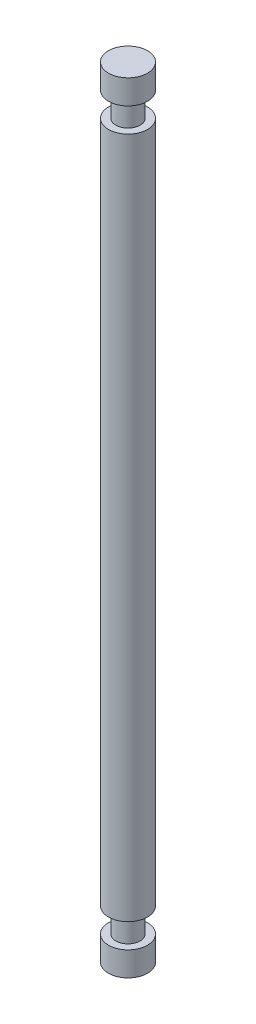
ISO-10303-21;
HEADER;
FILE_DESCRIPTION(('STEP AP214'),'2;1');
FILE_NAME('part.step','',(''),(''),'','','');
FILE_SCHEMA(('AUTOMOTIVE_DESIGN { 1 0 10303 214 1 1 1 1 }'));
ENDSEC;
DATA;
#1=APPLICATION_CONTEXT('core data for automotive mechanical design processes');
#2=APPLICATION_PROTOCOL_DEFINITION('international standard','automotive_design',2000,#1);
#3=PRODUCT_CONTEXT('',#1,'mechanical');
#4=PRODUCT('Part','Part','',(#3));
#5=PRODUCT_RELATED_PRODUCT_CATEGORY('part','',(#4));
#6=PRODUCT_DEFINITION_FORMATION('','',#4);
#7=PRODUCT_DEFINITION_CONTEXT('part definition',#1,'design');
#8=PRODUCT_DEFINITION('design','',#6,#7);
#9=PRODUCT_DEFINITION_SHAPE('','',#8);
#10=(LENGTH_UNIT() NAMED_UNIT(*) SI_UNIT(.MILLI.,.METRE.));
#11=(NAMED_UNIT(*) PLANE_ANGLE_UNIT() SI_UNIT($,.RADIAN.));
#12=(NAMED_UNIT(*) SI_UNIT($,.STERADIAN.) SOLID_ANGLE_UNIT());
#13=UNCERTAINTY_MEASURE_WITH_UNIT(LENGTH_MEASURE(1.E-05),#10,'distance_accuracy_value','');
#14=(GEOMETRIC_REPRESENTATION_CONTEXT(3) GLOBAL_UNCERTAINTY_ASSIGNED_CONTEXT((#13)) GLOBAL_UNIT_ASSIGNED_CONTEXT((#10,
#11,#12)) REPRESENTATION_CONTEXT('',''));
#15=CARTESIAN_POINT('',(0.,0.,0.));
#16=DIRECTION('',(0.,0.,1.));
#17=DIRECTION('',(1.,0.,0.));
#18=AXIS2_PLACEMENT_3D('',#15,#16,#17);
#19=CARTESIAN_POINT('',(0.,30.,0.));
#20=DIRECTION('',(0.,-1.,0.));
#21=DIRECTION('',(0.,0.,-1.));
#22=AXIS2_PLACEMENT_3D('',#19,#20,#21);
#23=CYLINDRICAL_SURFACE('',#22,0.8);
#24=CARTESIAN_POINT('',(0.,0.,0.));
#25=DIRECTION('',(0.,1.,0.));
#26=DIRECTION('',(0.,0.,1.));
#27=AXIS2_PLACEMENT_3D('',#24,#25,#26);
#28=CIRCLE('',#27,0.8);
#29=CARTESIAN_POINT('',(0.,0.,0.8));
#30=VERTEX_POINT('',#29);
#31=EDGE_CURVE('E42',#30,#30,#28,.T.);
#32=ORIENTED_EDGE('',*,*,#31,.T.);
#33=EDGE_LOOP('',(#32));
#34=FACE_BOUND('',#33,.T.);
#35=CARTESIAN_POINT('',(0.,28.,0.));
#36=DIRECTION('',(0.,1.,0.));
#37=DIRECTION('',(0.,0.,1.));
#38=AXIS2_PLACEMENT_3D('',#35,#36,#37);
#39=CIRCLE('',#38,0.8);
#40=CARTESIAN_POINT('',(0.,28.,0.8));
#41=VERTEX_POINT('',#40);
#42=EDGE_CURVE('E51',#41,#41,#39,.T.);
#43=ORIENTED_EDGE('',*,*,#42,.F.);
#44=EDGE_LOOP('',(#43));
#45=FACE_BOUND('',#44,.T.);
#46=ADVANCED_FACE('F31',(#34,#45),#23,.T.);
#47=CARTESIAN_POINT('',(0.,0.,0.));
#48=DIRECTION('',(0.,1.,0.));
#49=DIRECTION('',(0.,0.,1.));
#50=AXIS2_PLACEMENT_3D('',#47,#48,#49);
#51=PLANE('',#50);
#52=CARTESIAN_POINT('',(0.,0.,0.));
#53=DIRECTION('',(0.,1.,0.));
#54=DIRECTION('',(0.,0.,1.));
#55=AXIS2_PLACEMENT_3D('',#52,#53,#54);
#56=CIRCLE('',#55,0.5);
#57=CARTESIAN_POINT('',(0.,0.,0.5));
#58=VERTEX_POINT('',#57);
#59=EDGE_CURVE('E10',#58,#58,#56,.F.);
#60=ORIENTED_EDGE('',*,*,#59,.F.);
#61=EDGE_LOOP('',(#60));
#62=FACE_BOUND('',#61,.T.);
#63=ORIENTED_EDGE('',*,*,#31,.F.);
#64=EDGE_LOOP('',(#63));
#65=FACE_BOUND('',#64,.T.);
#66=ADVANCED_FACE('F87',(#62,#65),#51,.F.);
#67=CARTESIAN_POINT('',(0.,-1.,0.));
#68=DIRECTION('',(0.,1.,0.));
#69=DIRECTION('',(0.,0.,1.));
#70=AXIS2_PLACEMENT_3D('',#67,#68,#69);
#71=CYLINDRICAL_SURFACE('',#70,0.5);
#72=CARTESIAN_POINT('',(0.,-1.,0.));
#73=DIRECTION('',(0.,-1.,0.));
#74=DIRECTION('',(0.,0.,-1.));
#75=AXIS2_PLACEMENT_3D('',#72,#73,#74);
#76=CIRCLE('',#75,0.5);
#77=CARTESIAN_POINT('',(0.,-1.,-0.5));
#78=VERTEX_POINT('',#77);
#79=EDGE_CURVE('E47',#78,#78,#76,.T.);
#80=ORIENTED_EDGE('',*,*,#79,.F.);
#81=EDGE_LOOP('',(#80));
#82=FACE_BOUND('',#81,.T.);
#83=ORIENTED_EDGE('',*,*,#59,.T.);
#84=EDGE_LOOP('',(#83));
#85=FACE_BOUND('',#84,.T.);
#86=ADVANCED_FACE('F92',(#82,#85),#71,.T.);
#87=CARTESIAN_POINT('',(0.,28.,0.));
#88=DIRECTION('',(0.,1.,0.));
#89=DIRECTION('',(0.,0.,1.));
#90=AXIS2_PLACEMENT_3D('',#87,#88,#89);
#91=PLANE('',#90);
#92=CARTESIAN_POINT('',(0.,28.,0.));
#93=DIRECTION('',(0.,1.,0.));
#94=DIRECTION('',(0.,0.,1.));
#95=AXIS2_PLACEMENT_3D('',#92,#93,#94);
#96=CIRCLE('',#95,0.5);
#97=CARTESIAN_POINT('',(0.,28.,0.5));
#98=VERTEX_POINT('',#97);
#99=EDGE_CURVE('E55',#98,#98,#96,.T.);
#100=ORIENTED_EDGE('',*,*,#99,.F.);
#101=EDGE_LOOP('',(#100));
#102=FACE_BOUND('',#101,.T.);
#103=ORIENTED_EDGE('',*,*,#42,.T.);
#104=EDGE_LOOP('',(#103));
#105=FACE_BOUND('',#104,.T.);
#106=ADVANCED_FACE('F108',(#102,#105),#91,.T.);
#107=CARTESIAN_POINT('',(0.,29.,0.));
#108=DIRECTION('',(0.,1.,0.));
#109=DIRECTION('',(0.,0.,1.));
#110=AXIS2_PLACEMENT_3D('',#107,#108,#109);
#111=PLANE('',#110);
#112=CARTESIAN_POINT('',(0.,29.,0.));
#113=DIRECTION('',(0.,1.,0.));
#114=DIRECTION('',(0.,0.,1.));
#115=AXIS2_PLACEMENT_3D('',#112,#113,#114);
#116=CIRCLE('',#115,0.5);
#117=CARTESIAN_POINT('',(0.,29.,0.5));
#118=VERTEX_POINT('',#117);
#119=EDGE_CURVE('E58',#118,#118,#116,.T.);
#120=ORIENTED_EDGE('',*,*,#119,.T.);
#121=EDGE_LOOP('',(#120));
#122=FACE_BOUND('',#121,.T.);
#123=CARTESIAN_POINT('',(0.,29.,0.));
#124=DIRECTION('',(0.,1.,0.));
#125=DIRECTION('',(0.,0.,1.));
#126=AXIS2_PLACEMENT_3D('',#123,#124,#125);
#127=CIRCLE('',#126,0.8);
#128=CARTESIAN_POINT('',(0.,29.,0.8));
#129=VERTEX_POINT('',#128);
#130=EDGE_CURVE('E52',#129,#129,#127,.T.);
#131=ORIENTED_EDGE('',*,*,#130,.F.);
#132=EDGE_LOOP('',(#131));
#133=FACE_BOUND('',#132,.T.);
#134=ADVANCED_FACE('F106',(#122,#133),#111,.F.);
#135=CARTESIAN_POINT('',(0.,28.,0.));
#136=DIRECTION('',(0.,1.,0.));
#137=DIRECTION('',(0.,0.,1.));
#138=AXIS2_PLACEMENT_3D('',#135,#136,#137);
#139=CYLINDRICAL_SURFACE('',#138,0.5);
#140=ORIENTED_EDGE('',*,*,#99,.T.);
#141=EDGE_LOOP('',(#140));
#142=FACE_BOUND('',#141,.T.);
#143=ORIENTED_EDGE('',*,*,#119,.F.);
#144=EDGE_LOOP('',(#143));
#145=FACE_BOUND('',#144,.T.);
#146=ADVANCED_FACE('F101',(#142,#145),#139,.T.);
#147=CARTESIAN_POINT('',(0.,30.,0.));
#148=DIRECTION('',(0.,1.,0.));
#149=DIRECTION('',(0.,0.,1.));
#150=AXIS2_PLACEMENT_3D('',#147,#148,#149);
#151=PLANE('',#150);
#152=CARTESIAN_POINT('',(0.,30.,0.));
#153=DIRECTION('',(0.,1.,0.));
#154=DIRECTION('',(0.,0.,1.));
#155=AXIS2_PLACEMENT_3D('',#152,#153,#154);
#156=CIRCLE('',#155,0.8);
#157=CARTESIAN_POINT('',(0.,30.,0.8));
#158=VERTEX_POINT('',#157);
#159=EDGE_CURVE('E38',#158,#158,#156,.T.);
#160=ORIENTED_EDGE('',*,*,#159,.T.);
#161=EDGE_LOOP('',(#160));
#162=FACE_BOUND('',#161,.T.);
#163=ADVANCED_FACE('F96',(#162),#151,.T.);
#164=ORIENTED_EDGE('',*,*,#130,.T.);
#165=EDGE_LOOP('',(#164));
#166=FACE_BOUND('',#165,.T.);
#167=ORIENTED_EDGE('',*,*,#159,.F.);
#168=EDGE_LOOP('',(#167));
#169=FACE_BOUND('',#168,.T.);
#170=ADVANCED_FACE('F33',(#166,#169),#23,.T.);
#171=CARTESIAN_POINT('',(0.,-2.,0.));
#172=DIRECTION('',(0.,1.,0.));
#173=DIRECTION('',(0.,0.,1.));
#174=AXIS2_PLACEMENT_3D('',#171,#172,#173);
#175=CYLINDRICAL_SURFACE('',#174,0.8);
#176=CARTESIAN_POINT('',(0.,-2.,0.));
#177=DIRECTION('',(0.,-1.,0.));
#178=DIRECTION('',(0.,0.,-1.));
#179=AXIS2_PLACEMENT_3D('',#176,#177,#178);
#180=CIRCLE('',#179,0.8);
#181=CARTESIAN_POINT('',(0.,-2.,-0.8));
#182=VERTEX_POINT('',#181);
#183=EDGE_CURVE('E61',#182,#182,#180,.T.);
#184=ORIENTED_EDGE('',*,*,#183,.F.);
#185=EDGE_LOOP('',(#184));
#186=FACE_BOUND('',#185,.T.);
#187=CARTESIAN_POINT('',(0.,-1.,0.));
#188=DIRECTION('',(0.,-1.,0.));
#189=DIRECTION('',(0.,0.,-1.));
#190=AXIS2_PLACEMENT_3D('',#187,#188,#189);
#191=CIRCLE('',#190,0.8);
#192=CARTESIAN_POINT('',(0.,-1.,-0.8));
#193=VERTEX_POINT('',#192);
#194=EDGE_CURVE('E64',#193,#193,#191,.T.);
#195=ORIENTED_EDGE('',*,*,#194,.T.);
#196=EDGE_LOOP('',(#195));
#197=FACE_BOUND('',#196,.T.);
#198=ADVANCED_FACE('F72',(#186,#197),#175,.T.);
#199=CARTESIAN_POINT('',(0.,-2.,0.));
#200=DIRECTION('',(0.,-1.,0.));
#201=DIRECTION('',(0.,0.,-1.));
#202=AXIS2_PLACEMENT_3D('',#199,#200,#201);
#203=PLANE('',#202);
#204=ORIENTED_EDGE('',*,*,#183,.T.);
#205=EDGE_LOOP('',(#204));
#206=FACE_BOUND('',#205,.T.);
#207=ADVANCED_FACE('F70',(#206),#203,.T.);
#208=CARTESIAN_POINT('',(0.,-1.,0.));
#209=DIRECTION('',(0.,-1.,0.));
#210=DIRECTION('',(0.,0.,-1.));
#211=AXIS2_PLACEMENT_3D('',#208,#209,#210);
#212=PLANE('',#211);
#213=ORIENTED_EDGE('',*,*,#79,.T.);
#214=EDGE_LOOP('',(#213));
#215=FACE_BOUND('',#214,.T.);
#216=ORIENTED_EDGE('',*,*,#194,.F.);
#217=EDGE_LOOP('',(#216));
#218=FACE_BOUND('',#217,.T.);
#219=ADVANCED_FACE('F78',(#215,#218),#212,.F.);
#220=CLOSED_SHELL('',(#46,#66,#86,#106,#134,#146,#163,#170,#198,#207,#219));
#221=MANIFOLD_SOLID_BREP('B2',#220);
#222=ADVANCED_BREP_SHAPE_REPRESENTATION('',(#18,#221),#14);
#223=SHAPE_DEFINITION_REPRESENTATION(#9,#222);
ENDSEC;
END-ISO-10303-21;
